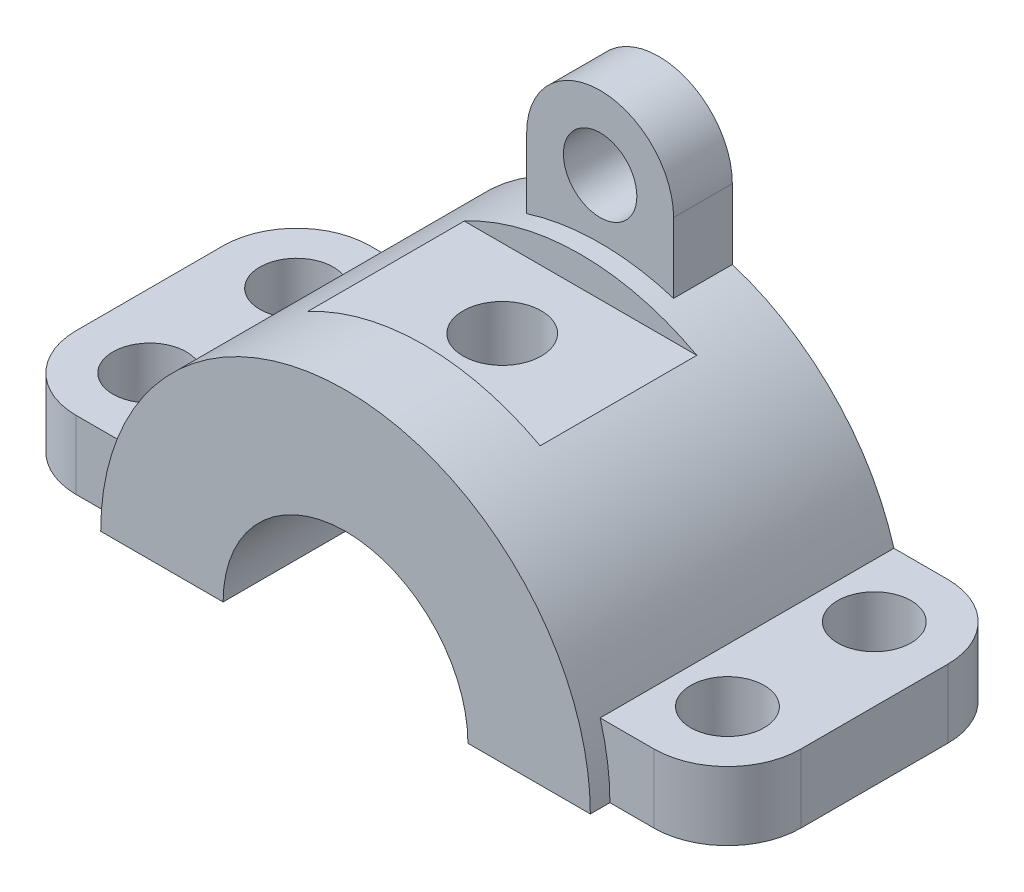
ISO-10303-21;
HEADER;
FILE_DESCRIPTION(('STEP AP214'),'2;1');
FILE_NAME('part.step','',(''),(''),'','','');
FILE_SCHEMA(('AUTOMOTIVE_DESIGN { 1 0 10303 214 1 1 1 1 }'));
ENDSEC;
DATA;
#1=APPLICATION_CONTEXT('core data for automotive mechanical design processes');
#2=APPLICATION_PROTOCOL_DEFINITION('international standard','automotive_design',2000,#1);
#3=PRODUCT_CONTEXT('',#1,'mechanical');
#4=PRODUCT('Part','Part','',(#3));
#5=PRODUCT_RELATED_PRODUCT_CATEGORY('part','',(#4));
#6=PRODUCT_DEFINITION_FORMATION('','',#4);
#7=PRODUCT_DEFINITION_CONTEXT('part definition',#1,'design');
#8=PRODUCT_DEFINITION('design','',#6,#7);
#9=PRODUCT_DEFINITION_SHAPE('','',#8);
#10=(LENGTH_UNIT() NAMED_UNIT(*) SI_UNIT(.MILLI.,.METRE.));
#11=(NAMED_UNIT(*) PLANE_ANGLE_UNIT() SI_UNIT($,.RADIAN.));
#12=(NAMED_UNIT(*) SI_UNIT($,.STERADIAN.) SOLID_ANGLE_UNIT());
#13=UNCERTAINTY_MEASURE_WITH_UNIT(LENGTH_MEASURE(1.E-05),#10,'distance_accuracy_value','');
#14=(GEOMETRIC_REPRESENTATION_CONTEXT(3) GLOBAL_UNCERTAINTY_ASSIGNED_CONTEXT((#13)) GLOBAL_UNIT_ASSIGNED_CONTEXT((#10,
#11,#12)) REPRESENTATION_CONTEXT('',''));
#15=CARTESIAN_POINT('',(0.,0.,0.));
#16=DIRECTION('',(0.,0.,1.));
#17=DIRECTION('',(1.,0.,0.));
#18=AXIS2_PLACEMENT_3D('',#15,#16,#17);
#19=CARTESIAN_POINT('',(0.,0.,64.));
#20=DIRECTION('',(0.,0.,-1.));
#21=DIRECTION('',(-1.,0.,0.));
#22=AXIS2_PLACEMENT_3D('',#19,#20,#21);
#23=CYLINDRICAL_SURFACE('',#22,50.);
#24=CARTESIAN_POINT('',(0.,0.,0.));
#25=DIRECTION('',(0.,0.,1.));
#26=DIRECTION('',(1.,0.,0.));
#27=AXIS2_PLACEMENT_3D('',#24,#25,#26);
#28=CIRCLE('',#27,50.);
#29=CARTESIAN_POINT('',(48.,14.,0.));
#30=VERTEX_POINT('',#29);
#31=CARTESIAN_POINT('',(15.,47.6969600708473,0.));
#32=VERTEX_POINT('',#31);
#33=EDGE_CURVE('E348',#30,#32,#28,.T.);
#34=ORIENTED_EDGE('',*,*,#33,.T.);
#35=DIRECTION('',(0.,0.,-1.));
#36=VECTOR('',#35,1.);
#37=CARTESIAN_POINT('',(15.,47.6969600708473,12.));
#38=LINE('',#37,#36);
#39=CARTESIAN_POINT('',(15.,47.6969600708473,12.));
#40=VERTEX_POINT('',#39);
#41=EDGE_CURVE('E247',#40,#32,#38,.T.);
#42=ORIENTED_EDGE('',*,*,#41,.F.);
#43=CARTESIAN_POINT('',(0.,0.,12.));
#44=DIRECTION('',(0.,0.,1.));
#45=DIRECTION('',(1.,0.,0.));
#46=AXIS2_PLACEMENT_3D('',#43,#44,#45);
#47=CIRCLE('',#46,50.);
#48=CARTESIAN_POINT('',(-15.,47.6969600708473,12.));
#49=VERTEX_POINT('',#48);
#50=EDGE_CURVE('E244',#40,#49,#47,.T.);
#51=ORIENTED_EDGE('',*,*,#50,.T.);
#52=DIRECTION('',(0.,0.,-1.));
#53=VECTOR('',#52,1.);
#54=CARTESIAN_POINT('',(-15.,47.6969600708473,12.));
#55=LINE('',#54,#53);
#56=CARTESIAN_POINT('',(-15.,47.6969600708473,0.));
#57=VERTEX_POINT('',#56);
#58=EDGE_CURVE('E266',#49,#57,#55,.T.);
#59=ORIENTED_EDGE('',*,*,#58,.T.);
#60=CARTESIAN_POINT('',(-48.,14.,0.));
#61=VERTEX_POINT('',#60);
#62=EDGE_CURVE('E347',#57,#61,#28,.T.);
#63=ORIENTED_EDGE('',*,*,#62,.T.);
#64=DIRECTION('',(0.,0.,-1.));
#65=VECTOR('',#64,1.);
#66=CARTESIAN_POINT('',(-48.,14.,60.));
#67=LINE('',#66,#65);
#68=CARTESIAN_POINT('',(-48.,14.,60.));
#69=VERTEX_POINT('',#68);
#70=EDGE_CURVE('E300',#69,#61,#67,.T.);
#71=ORIENTED_EDGE('',*,*,#70,.F.);
#72=CARTESIAN_POINT('',(0.,0.,60.));
#73=DIRECTION('',(0.,0.,1.));
#74=DIRECTION('',(1.,0.,0.));
#75=AXIS2_PLACEMENT_3D('',#72,#73,#74);
#76=CIRCLE('',#75,50.);
#77=CARTESIAN_POINT('',(-50.,0.,60.));
#78=VERTEX_POINT('',#77);
#79=EDGE_CURVE('E278',#69,#78,#76,.T.);
#80=ORIENTED_EDGE('',*,*,#79,.T.);
#81=DIRECTION('',(0.,0.,-1.));
#82=VECTOR('',#81,1.);
#83=CARTESIAN_POINT('',(-50.,0.,64.));
#84=LINE('',#83,#82);
#85=CARTESIAN_POINT('',(-50.,0.,64.));
#86=VERTEX_POINT('',#85);
#87=EDGE_CURVE('E363',#86,#78,#84,.T.);
#88=ORIENTED_EDGE('',*,*,#87,.F.);
#89=CARTESIAN_POINT('',(0.,0.,64.));
#90=DIRECTION('',(0.,0.,1.));
#91=DIRECTION('',(1.,0.,0.));
#92=AXIS2_PLACEMENT_3D('',#89,#90,#91);
#93=CIRCLE('',#92,50.);
#94=CARTESIAN_POINT('',(50.,0.,64.));
#95=VERTEX_POINT('',#94);
#96=EDGE_CURVE('E332',#95,#86,#93,.T.);
#97=ORIENTED_EDGE('',*,*,#96,.F.);
#98=DIRECTION('',(0.,0.,-1.));
#99=VECTOR('',#98,1.);
#100=CARTESIAN_POINT('',(50.,0.,64.));
#101=LINE('',#100,#99);
#102=CARTESIAN_POINT('',(50.,0.,60.));
#103=VERTEX_POINT('',#102);
#104=EDGE_CURVE('E367',#95,#103,#101,.T.);
#105=ORIENTED_EDGE('',*,*,#104,.T.);
#106=CARTESIAN_POINT('',(0.,0.,60.));
#107=DIRECTION('',(0.,0.,1.));
#108=DIRECTION('',(1.,0.,0.));
#109=AXIS2_PLACEMENT_3D('',#106,#107,#108);
#110=CIRCLE('',#109,50.);
#111=CARTESIAN_POINT('',(48.,14.,60.));
#112=VERTEX_POINT('',#111);
#113=EDGE_CURVE('E305',#103,#112,#110,.T.);
#114=ORIENTED_EDGE('',*,*,#113,.T.);
#115=DIRECTION('',(0.,0.,-1.));
#116=VECTOR('',#115,1.);
#117=CARTESIAN_POINT('',(48.,14.,60.));
#118=LINE('',#117,#116);
#119=EDGE_CURVE('E315',#112,#30,#118,.T.);
#120=ORIENTED_EDGE('',*,*,#119,.T.);
#121=EDGE_LOOP('',(#34,#42,#51,#59,#63,#71,#80,#88,#97,#105,#114,#120));
#122=FACE_BOUND('',#121,.T.);
#123=CARTESIAN_POINT('',(0.,0.,16.));
#124=DIRECTION('',(0.,0.,1.));
#125=DIRECTION('',(1.,0.,0.));
#126=AXIS2_PLACEMENT_3D('',#123,#124,#125);
#127=CIRCLE('',#126,50.);
#128=CARTESIAN_POINT('',(23.7486841740758,44.,16.));
#129=VERTEX_POINT('',#128);
#130=CARTESIAN_POINT('',(-23.7486841740758,44.,16.));
#131=VERTEX_POINT('',#130);
#132=EDGE_CURVE('E187',#129,#131,#127,.T.);
#133=ORIENTED_EDGE('',*,*,#132,.F.);
#134=DIRECTION('',(0.,0.,1.));
#135=VECTOR('',#134,1.);
#136=CARTESIAN_POINT('',(23.7486841740758,44.,16.));
#137=LINE('',#136,#135);
#138=CARTESIAN_POINT('',(23.7486841740758,44.,48.));
#139=VERTEX_POINT('',#138);
#140=EDGE_CURVE('E200',#129,#139,#137,.T.);
#141=ORIENTED_EDGE('',*,*,#140,.T.);
#142=CARTESIAN_POINT('',(0.,0.,48.));
#143=DIRECTION('',(0.,0.,1.));
#144=DIRECTION('',(1.,0.,0.));
#145=AXIS2_PLACEMENT_3D('',#142,#143,#144);
#146=CIRCLE('',#145,50.);
#147=CARTESIAN_POINT('',(-23.7486841740758,44.,48.));
#148=VERTEX_POINT('',#147);
#149=EDGE_CURVE('E203',#139,#148,#146,.T.);
#150=ORIENTED_EDGE('',*,*,#149,.T.);
#151=DIRECTION('',(0.,0.,1.));
#152=VECTOR('',#151,1.);
#153=CARTESIAN_POINT('',(-23.7486841740758,44.,16.));
#154=LINE('',#153,#152);
#155=EDGE_CURVE('E198',#131,#148,#154,.T.);
#156=ORIENTED_EDGE('',*,*,#155,.F.);
#157=EDGE_LOOP('',(#133,#141,#150,#156));
#158=FACE_BOUND('',#157,.T.);
#159=ADVANCED_FACE('F47',(#122,#158),#23,.T.);
#160=CARTESIAN_POINT('',(0.,0.,64.));
#161=DIRECTION('',(0.,1.,0.));
#162=DIRECTION('',(0.,0.,1.));
#163=AXIS2_PLACEMENT_3D('',#160,#161,#162);
#164=PLANE('',#163);
#165=CARTESIAN_POINT('',(59.,0.,15.));
#166=DIRECTION('',(0.,1.,0.));
#167=DIRECTION('',(0.,0.,-1.));
#168=AXIS2_PLACEMENT_3D('',#165,#166,#167);
#169=CIRCLE('',#168,7.5);
#170=CARTESIAN_POINT('',(59.,0.,7.5));
#171=VERTEX_POINT('',#170);
#172=EDGE_CURVE('E214',#171,#171,#169,.T.);
#173=ORIENTED_EDGE('',*,*,#172,.T.);
#174=EDGE_LOOP('',(#173));
#175=FACE_BOUND('',#174,.T.);
#176=CARTESIAN_POINT('',(59.,0.,45.));
#177=DIRECTION('',(0.,1.,0.));
#178=DIRECTION('',(0.,0.,1.));
#179=AXIS2_PLACEMENT_3D('',#176,#177,#178);
#180=CIRCLE('',#179,7.5);
#181=CARTESIAN_POINT('',(59.,0.,52.5));
#182=VERTEX_POINT('',#181);
#183=EDGE_CURVE('E207',#182,#182,#180,.T.);
#184=ORIENTED_EDGE('',*,*,#183,.T.);
#185=EDGE_LOOP('',(#184));
#186=FACE_BOUND('',#185,.T.);
#187=DIRECTION('',(1.,0.,0.));
#188=VECTOR('',#187,1.);
#189=CARTESIAN_POINT('',(0.,0.,0.));
#190=LINE('',#189,#188);
#191=CARTESIAN_POINT('',(25.,0.,0.));
#192=VERTEX_POINT('',#191);
#193=CARTESIAN_POINT('',(59.,0.,0.));
#194=VERTEX_POINT('',#193);
#195=EDGE_CURVE('E304',#192,#194,#190,.T.);
#196=ORIENTED_EDGE('',*,*,#195,.T.);
#197=CARTESIAN_POINT('',(59.,0.,15.));
#198=DIRECTION('',(0.,1.,0.));
#199=DIRECTION('',(0.,0.,1.));
#200=AXIS2_PLACEMENT_3D('',#197,#198,#199);
#201=CIRCLE('',#200,15.);
#202=CARTESIAN_POINT('',(74.,0.,15.));
#203=VERTEX_POINT('',#202);
#204=EDGE_CURVE('E394',#194,#203,#201,.F.);
#205=ORIENTED_EDGE('',*,*,#204,.T.);
#206=DIRECTION('',(0.,0.,-1.));
#207=VECTOR('',#206,1.);
#208=CARTESIAN_POINT('',(74.,0.,60.));
#209=LINE('',#208,#207);
#210=CARTESIAN_POINT('',(74.,0.,45.));
#211=VERTEX_POINT('',#210);
#212=EDGE_CURVE('E292',#211,#203,#209,.T.);
#213=ORIENTED_EDGE('',*,*,#212,.F.);
#214=CARTESIAN_POINT('',(59.,0.,45.));
#215=DIRECTION('',(0.,1.,0.));
#216=DIRECTION('',(0.,0.,1.));
#217=AXIS2_PLACEMENT_3D('',#214,#215,#216);
#218=CIRCLE('',#217,15.);
#219=CARTESIAN_POINT('',(59.,0.,60.));
#220=VERTEX_POINT('',#219);
#221=EDGE_CURVE('E391',#211,#220,#218,.F.);
#222=ORIENTED_EDGE('',*,*,#221,.T.);
#223=DIRECTION('',(-1.,0.,0.));
#224=VECTOR('',#223,1.);
#225=CARTESIAN_POINT('',(0.,0.,60.));
#226=LINE('',#225,#224);
#227=EDGE_CURVE('E309',#220,#103,#226,.T.);
#228=ORIENTED_EDGE('',*,*,#227,.T.);
#229=ORIENTED_EDGE('',*,*,#104,.F.);
#230=DIRECTION('',(1.,0.,0.));
#231=VECTOR('',#230,1.);
#232=CARTESIAN_POINT('',(0.,0.,64.));
#233=LINE('',#232,#231);
#234=CARTESIAN_POINT('',(25.,0.,64.));
#235=VERTEX_POINT('',#234);
#236=EDGE_CURVE('E328',#235,#95,#233,.T.);
#237=ORIENTED_EDGE('',*,*,#236,.F.);
#238=DIRECTION('',(0.,0.,-1.));
#239=VECTOR('',#238,1.);
#240=CARTESIAN_POINT('',(25.,0.,64.));
#241=LINE('',#240,#239);
#242=EDGE_CURVE('E343',#235,#192,#241,.T.);
#243=ORIENTED_EDGE('',*,*,#242,.T.);
#244=EDGE_LOOP('',(#196,#205,#213,#222,#228,#229,#237,#243));
#245=FACE_BOUND('',#244,.T.);
#246=ADVANCED_FACE('F453',(#175,#186,#245),#164,.F.);
#247=CARTESIAN_POINT('',(0.,0.,64.));
#248=DIRECTION('',(0.,1.,0.));
#249=DIRECTION('',(0.,0.,1.));
#250=AXIS2_PLACEMENT_3D('',#247,#248,#249);
#251=PLANE('',#250);
#252=CARTESIAN_POINT('',(-59.,0.,45.));
#253=DIRECTION('',(0.,1.,0.));
#254=DIRECTION('',(0.,0.,-1.));
#255=AXIS2_PLACEMENT_3D('',#252,#253,#254);
#256=CIRCLE('',#255,7.5);
#257=CARTESIAN_POINT('',(-59.,0.,37.5));
#258=VERTEX_POINT('',#257);
#259=EDGE_CURVE('E215',#258,#258,#256,.T.);
#260=ORIENTED_EDGE('',*,*,#259,.T.);
#261=EDGE_LOOP('',(#260));
#262=FACE_BOUND('',#261,.T.);
#263=CARTESIAN_POINT('',(-59.,0.,15.));
#264=DIRECTION('',(0.,1.,0.));
#265=DIRECTION('',(0.,0.,1.));
#266=AXIS2_PLACEMENT_3D('',#263,#264,#265);
#267=CIRCLE('',#266,7.5);
#268=CARTESIAN_POINT('',(-59.,0.,22.5));
#269=VERTEX_POINT('',#268);
#270=EDGE_CURVE('E219',#269,#269,#267,.T.);
#271=ORIENTED_EDGE('',*,*,#270,.T.);
#272=EDGE_LOOP('',(#271));
#273=FACE_BOUND('',#272,.T.);
#274=DIRECTION('',(1.,0.,0.));
#275=VECTOR('',#274,1.);
#276=CARTESIAN_POINT('',(0.,0.,60.));
#277=LINE('',#276,#275);
#278=CARTESIAN_POINT('',(-59.,0.,60.));
#279=VERTEX_POINT('',#278);
#280=EDGE_CURVE('E286',#279,#78,#277,.T.);
#281=ORIENTED_EDGE('',*,*,#280,.F.);
#282=CARTESIAN_POINT('',(-59.,0.,45.));
#283=DIRECTION('',(0.,1.,0.));
#284=DIRECTION('',(0.,0.,1.));
#285=AXIS2_PLACEMENT_3D('',#282,#283,#284);
#286=CIRCLE('',#285,15.);
#287=CARTESIAN_POINT('',(-74.,0.,45.));
#288=VERTEX_POINT('',#287);
#289=EDGE_CURVE('E11',#279,#288,#286,.F.);
#290=ORIENTED_EDGE('',*,*,#289,.T.);
#291=DIRECTION('',(0.,0.,-1.));
#292=VECTOR('',#291,1.);
#293=CARTESIAN_POINT('',(-74.,0.,60.));
#294=LINE('',#293,#292);
#295=CARTESIAN_POINT('',(-74.,0.,15.));
#296=VERTEX_POINT('',#295);
#297=EDGE_CURVE('E289',#288,#296,#294,.T.);
#298=ORIENTED_EDGE('',*,*,#297,.T.);
#299=CARTESIAN_POINT('',(-59.,0.,15.));
#300=DIRECTION('',(0.,1.,0.));
#301=DIRECTION('',(0.,0.,1.));
#302=AXIS2_PLACEMENT_3D('',#299,#300,#301);
#303=CIRCLE('',#302,15.);
#304=CARTESIAN_POINT('',(-59.,0.,0.));
#305=VERTEX_POINT('',#304);
#306=EDGE_CURVE('E57',#296,#305,#303,.F.);
#307=ORIENTED_EDGE('',*,*,#306,.T.);
#308=DIRECTION('',(1.,0.,0.));
#309=VECTOR('',#308,1.);
#310=CARTESIAN_POINT('',(0.,0.,0.));
#311=LINE('',#310,#309);
#312=CARTESIAN_POINT('',(-25.,0.,0.));
#313=VERTEX_POINT('',#312);
#314=EDGE_CURVE('E351',#305,#313,#311,.T.);
#315=ORIENTED_EDGE('',*,*,#314,.T.);
#316=DIRECTION('',(0.,0.,-1.));
#317=VECTOR('',#316,1.);
#318=CARTESIAN_POINT('',(-25.,0.,64.));
#319=LINE('',#318,#317);
#320=CARTESIAN_POINT('',(-25.,0.,64.));
#321=VERTEX_POINT('',#320);
#322=EDGE_CURVE('E359',#321,#313,#319,.T.);
#323=ORIENTED_EDGE('',*,*,#322,.F.);
#324=DIRECTION('',(1.,0.,0.));
#325=VECTOR('',#324,1.);
#326=CARTESIAN_POINT('',(0.,0.,64.));
#327=LINE('',#326,#325);
#328=EDGE_CURVE('E336',#86,#321,#327,.T.);
#329=ORIENTED_EDGE('',*,*,#328,.F.);
#330=ORIENTED_EDGE('',*,*,#87,.T.);
#331=EDGE_LOOP('',(#281,#290,#298,#307,#315,#323,#329,#330));
#332=FACE_BOUND('',#331,.T.);
#333=ADVANCED_FACE('F460',(#262,#273,#332),#251,.F.);
#334=CARTESIAN_POINT('',(0.,0.,64.));
#335=DIRECTION('',(0.,0.,-1.));
#336=DIRECTION('',(-1.,0.,0.));
#337=AXIS2_PLACEMENT_3D('',#334,#335,#336);
#338=CYLINDRICAL_SURFACE('',#337,25.);
#339=CARTESIAN_POINT('',(0.,25.,40.));
#340=CARTESIAN_POINT('',(-0.218743265247565,24.9999999061477,39.9999998628105));
#341=CARTESIAN_POINT('',(-0.437488884251339,24.9971224010622,39.9910211081087));
#342=CARTESIAN_POINT('',(-0.87336189831748,24.985691347525,39.9551906748163));
#343=CARTESIAN_POINT('',(-1.09048927039918,24.9771377186217,39.9283387428966));
#344=CARTESIAN_POINT('',(-1.52153070666352,24.9545891858396,39.8570136966574));
#345=CARTESIAN_POINT('',(-1.73544490489068,24.9405945096043,39.8125413195441));
#346=CARTESIAN_POINT('',(-2.15863313908122,24.9075364102002,39.7063554259033));
#347=CARTESIAN_POINT('',(-2.36790535620395,24.888471036932,39.6446352757271));
#348=CARTESIAN_POINT('',(-2.77988031823148,24.8458260104941,39.5046321268035));
#349=CARTESIAN_POINT('',(-2.98259542357034,24.8222555090754,39.4263826724808));
#350=CARTESIAN_POINT('',(-3.3806527559984,24.7711822888404,39.253844594609));
#351=CARTESIAN_POINT('',(-3.5759921749842,24.7436780910757,39.1595499360163));
#352=CARTESIAN_POINT('',(-3.95794908794835,24.6854603705866,38.9556804571037));
#353=CARTESIAN_POINT('',(-4.1445690395948,24.6547477601795,38.8461099775389));
#354=CARTESIAN_POINT('',(-4.50811504509705,24.5908719246595,38.6123839256726));
#355=CARTESIAN_POINT('',(-4.68503659666327,24.5577075778769,38.4882216621168));
#356=CARTESIAN_POINT('',(-5.03301408453022,24.488796033414,38.2223853092816));
#357=CARTESIAN_POINT('',(-5.20375408879707,24.4530019467294,38.0803096991258));
#358=CARTESIAN_POINT('',(-5.53275380725715,24.3806687959203,37.7825482279537));
#359=CARTESIAN_POINT('',(-5.6910132690735,24.3441297167497,37.6268620918447));
#360=CARTESIAN_POINT('',(-5.99413557676902,24.2712721273087,37.302790073572));
#361=CARTESIAN_POINT('',(-6.13899335443544,24.2349537052978,37.1343994302045));
#362=CARTESIAN_POINT('',(-6.4142713584007,24.1635539684896,36.7860614993963));
#363=CARTESIAN_POINT('',(-6.54469691314274,24.1284722003959,36.6061185161674));
#364=CARTESIAN_POINT('',(-6.79356627376886,24.0596046131892,36.2307796888984));
#365=CARTESIAN_POINT('',(-6.91159914571261,24.0258780779972,36.0351001392605));
#366=CARTESIAN_POINT('',(-7.13064926390917,23.9617792893349,35.6340106052583));
#367=CARTESIAN_POINT('',(-7.23167321503685,23.9314057157688,35.4286044961843));
#368=CARTESIAN_POINT('',(-7.4159292843064,23.8749509852088,35.0093875060848));
#369=CARTESIAN_POINT('',(-7.4991615561078,23.8488697911438,34.7955766976662));
#370=CARTESIAN_POINT('',(-7.64708668337306,23.8018507099147,34.3610854270542));
#371=CARTESIAN_POINT('',(-7.71178030064702,23.7809126114101,34.1404052475576));
#372=CARTESIAN_POINT('',(-7.82027654696604,23.7454507385788,33.7008526312977));
#373=CARTESIAN_POINT('',(-7.8646711461595,23.7307462657405,33.4821408546237));
#374=CARTESIAN_POINT('',(-7.93505826774671,23.7073033405608,33.0414578550603));
#375=CARTESIAN_POINT('',(-7.96105114480748,23.6985647732351,32.8194866950752));
#376=CARTESIAN_POINT('',(-7.99437065635129,23.6873457397689,32.374043844835));
#377=CARTESIAN_POINT('',(-8.00170182918087,23.6848637520901,32.1505725326596));
#378=CARTESIAN_POINT('',(-7.99763563591978,23.6862371500807,31.7038229413516));
#379=CARTESIAN_POINT('',(-7.98623874529433,23.690092374862,31.4805446574626));
#380=CARTESIAN_POINT('',(-7.9457042941483,23.703717269299,31.0452511076057));
#381=CARTESIAN_POINT('',(-7.91733072305877,23.7132321396269,30.8331561687252));
#382=CARTESIAN_POINT('',(-7.84374939322094,23.7376725259022,30.4121471921874));
#383=CARTESIAN_POINT('',(-7.79853566669938,23.7525999598911,30.2032343095305));
#384=CARTESIAN_POINT('',(-7.69168696924465,23.7874147928651,29.7901458318722));
#385=CARTESIAN_POINT('',(-7.63005683359996,23.8073007312625,29.5859688611743));
#386=CARTESIAN_POINT('',(-7.49085223656067,23.8514666562278,29.1835331797193));
#387=CARTESIAN_POINT('',(-7.41327173347221,23.8757483073899,28.9852767442324));
#388=CARTESIAN_POINT('',(-7.24151771277467,23.9284057786095,28.5931069361814));
#389=CARTESIAN_POINT('',(-7.14711609407102,23.9568367598391,28.3993009228504));
#390=CARTESIAN_POINT('',(-6.94318205382553,24.016734069374,28.0202308785065));
#391=CARTESIAN_POINT('',(-6.83364445495079,24.0482014351731,27.8349697993733));
#392=CARTESIAN_POINT('',(-6.60020078291722,24.1133164203648,27.4741267881247));
#393=CARTESIAN_POINT('',(-6.47629393858845,24.1469641567308,27.2985453762453));
#394=CARTESIAN_POINT('',(-6.21490027829255,24.2155584134681,26.9580676690233));
#395=CARTESIAN_POINT('',(-6.07741302148028,24.2505049759786,26.7931717208384));
#396=CARTESIAN_POINT('',(-5.7827580642572,24.3224956711356,26.4673474761484));
#397=CARTESIAN_POINT('',(-5.62496187025066,24.3595598527758,26.306991393903));
#398=CARTESIAN_POINT('',(-5.29641148883157,24.433099471755,26.0001217103981));
#399=CARTESIAN_POINT('',(-5.12566144275533,24.4695750927716,25.8536037184607));
#400=CARTESIAN_POINT('',(-4.77213983863553,24.5409699950185,25.5752575183532));
#401=CARTESIAN_POINT('',(-4.58936277455011,24.575888550969,25.4434361138275));
#402=CARTESIAN_POINT('',(-4.21308321485076,24.6431823932812,25.195540549152));
#403=CARTESIAN_POINT('',(-4.01958499097014,24.6755586803299,25.0794601798093));
#404=CARTESIAN_POINT('',(-3.62126665237258,24.7371662926383,24.8628945620304));
#405=CARTESIAN_POINT('',(-3.41636056460433,24.7663668098111,24.7625585073812));
#406=CARTESIAN_POINT('',(-2.99832036669397,24.8204446279348,24.5796153045643));
#407=CARTESIAN_POINT('',(-2.78518945939642,24.8453235913977,24.497001335781));
#408=CARTESIAN_POINT('',(-2.35217103924886,24.8900514164327,24.3501927487604));
#409=CARTESIAN_POINT('',(-2.13228393720666,24.9099005831638,24.2859970130536));
#410=CARTESIAN_POINT('',(-1.68740364417468,24.9439857927418,24.176629116786));
#411=CARTESIAN_POINT('',(-1.46241066837479,24.9582220716843,24.1314561560631));
#412=CARTESIAN_POINT('',(-1.01822864517731,24.9802051338952,24.0620099459849));
#413=CARTESIAN_POINT('',(-0.799171422951574,24.9881904590846,24.0369673630477));
#414=CARTESIAN_POINT('',(-0.359605520473419,24.998380097374,24.0050491805251));
#415=CARTESIAN_POINT('',(-0.139096881477433,25.0005845740889,23.9981730667754));
#416=CARTESIAN_POINT('',(0.30168438861145,24.9991510782414,24.0026530388314));
#417=CARTESIAN_POINT('',(0.521957047982117,24.99551390883,24.0140066182892));
#418=CARTESIAN_POINT('',(0.960643471861157,24.9825002143682,24.0548322282173));
#419=CARTESIAN_POINT('',(1.17905725268573,24.9731237397469,24.0843040994887));
#420=CARTESIAN_POINT('',(1.60666085758014,24.9492140183119,24.1600680666892));
#421=CARTESIAN_POINT('',(1.81594168521825,24.934824131048,24.2058933383947));
#422=CARTESIAN_POINT('',(2.22986305734505,24.9012216991691,24.3140722950302));
#423=CARTESIAN_POINT('',(2.43450202782658,24.8820075445802,24.3764314981203));
#424=CARTESIAN_POINT('',(2.83767351616122,24.8392571724058,24.5171405641666));
#425=CARTESIAN_POINT('',(3.03620765701014,24.8157221153545,24.5954861340355));
#426=CARTESIAN_POINT('',(3.4260590530831,24.7649102825711,24.767604732679));
#427=CARTESIAN_POINT('',(3.61737354934721,24.737632094513,24.861383587283));
#428=CARTESIAN_POINT('',(3.9961937967253,24.6793044180003,25.0661745521299));
#429=CARTESIAN_POINT('',(4.18348835944252,24.6481783487328,25.1775554837826));
#430=CARTESIAN_POINT('',(4.54814586170992,24.5835041721626,25.4150374650529));
#431=CARTESIAN_POINT('',(4.72550534170238,24.5499552303715,25.5411435956528));
#432=CARTESIAN_POINT('',(5.0691961991725,24.4812982895492,25.8072232399596));
#433=CARTESIAN_POINT('',(5.23552671030185,24.446190168402,25.9471978409147));
#434=CARTESIAN_POINT('',(5.55617802638371,24.3753123574237,26.2401348533353));
#435=CARTESIAN_POINT('',(5.71049855184838,24.3395426522205,26.3930975668778));
#436=CARTESIAN_POINT('',(6.01242126512026,24.2667654969751,26.7177686970901));
#437=CARTESIAN_POINT('',(6.15947074535408,24.2297690083856,26.8899941010449));
#438=CARTESIAN_POINT('',(6.43851923775673,24.1571160782401,27.2464036973992));
#439=CARTESIAN_POINT('',(6.57052327012398,24.1214591923783,27.4305838684802));
#440=CARTESIAN_POINT('',(6.818664580721,24.0524927808986,27.8098699845339));
#441=CARTESIAN_POINT('',(6.93479547633881,24.0191842021299,28.0049802803274));
#442=CARTESIAN_POINT('',(7.15020596800437,23.9559420021258,28.4047144344035));
#443=CARTESIAN_POINT('',(7.24949254862722,23.9260069837647,28.609334304437));
#444=CARTESIAN_POINT('',(7.43020088832158,23.870505447889,29.0261860595362));
#445=CARTESIAN_POINT('',(7.51167310646887,23.8449266381716,29.2383944102204));
#446=CARTESIAN_POINT('',(7.65636529827826,23.7988621590757,29.6693947768714));
#447=CARTESIAN_POINT('',(7.71959257425074,23.7783744525038,29.8881841200535));
#448=CARTESIAN_POINT('',(7.82723033979725,23.7431606371553,30.3307714104139));
#449=CARTESIAN_POINT('',(7.87164342134528,23.7284337347517,30.5545686631923));
#450=CARTESIAN_POINT('',(7.94121566442475,23.7052408808499,31.0054543831978));
#451=CARTESIAN_POINT('',(7.96637569553841,23.6967746465831,31.2325427013088));
#452=CARTESIAN_POINT('',(7.99645049180489,23.6866420864421,31.6773669424558));
#453=CARTESIAN_POINT('',(8.00226930238732,23.6846721480483,31.8950353088546));
#454=CARTESIAN_POINT('',(7.99614679514984,23.6867399313,32.3300921443389));
#455=CARTESIAN_POINT('',(7.98420580907816,23.6907775407262,32.5474806185769));
#456=CARTESIAN_POINT('',(7.94268054634167,23.7047316455029,32.9803580579318));
#457=CARTESIAN_POINT('',(7.91309736864517,23.7146477746681,33.1958471405175));
#458=CARTESIAN_POINT('',(7.83656732967567,23.7400470604446,33.6233835862019));
#459=CARTESIAN_POINT('',(7.78962040030635,23.7555302388885,33.8354309357997));
#460=CARTESIAN_POINT('',(7.67969358667199,23.7912922196723,34.2511736699373));
#461=CARTESIAN_POINT('',(7.61698826998021,23.8114885111398,34.4549489142845));
#462=CARTESIAN_POINT('',(7.47567925141456,23.8562299898703,34.8564903534286));
#463=CARTESIAN_POINT('',(7.39707024932657,23.8807766266318,35.0542545195756));
#464=CARTESIAN_POINT('',(7.2245841069833,23.933522740927,35.4424541768721));
#465=CARTESIAN_POINT('',(7.13070967680563,23.961721569905,35.6328909614473));
#466=CARTESIAN_POINT('',(6.92831365997189,24.0210238998718,36.0054244826735));
#467=CARTESIAN_POINT('',(6.81978682069163,24.0521284412685,36.1875181969862));
#468=CARTESIAN_POINT('',(6.5841334208022,24.1177267113063,36.5494718913765));
#469=CARTESIAN_POINT('',(6.45643079187723,24.1523067527788,36.7289413544939));
#470=CARTESIAN_POINT('',(6.18680926743207,24.2227744441253,37.076591818307));
#471=CARTESIAN_POINT('',(6.0448899286005,24.2586621347526,37.2447724667168));
#472=CARTESIAN_POINT('',(5.74766448038853,24.3307982502988,37.5689068571076));
#473=CARTESIAN_POINT('',(5.592352795832,24.3670468198413,37.7248554548458));
#474=CARTESIAN_POINT('',(5.26938993453573,24.4389215125895,38.0234442035621));
#475=CARTESIAN_POINT('',(5.10174285792805,24.4745478377931,38.1660887412173));
#476=CARTESIAN_POINT('',(4.74894112096545,24.5454895286252,38.4420072742542));
#477=CARTESIAN_POINT('',(4.56337747943053,24.5807495900706,38.5747731976782));
#478=CARTESIAN_POINT('',(4.18131157536835,24.6486157658354,38.8241227770652));
#479=CARTESIAN_POINT('',(3.98481320350349,24.6812228140783,38.9407121378448));
#480=CARTESIAN_POINT('',(3.58214010374018,24.7428727035054,39.1568485607601));
#481=CARTESIAN_POINT('',(3.37596625600628,24.7719158680257,39.2563971692549));
#482=CARTESIAN_POINT('',(2.95536223754053,24.8256070490431,39.4376247276937));
#483=CARTESIAN_POINT('',(2.74093265081571,24.8502553757369,39.5193049389182));
#484=CARTESIAN_POINT('',(2.32073755029346,24.8928821566616,39.6589609606134));
#485=CARTESIAN_POINT('',(2.11542697677707,24.9112083268921,39.7182019539219));
#486=CARTESIAN_POINT('',(1.70037248611578,24.942975795015,39.8201272503359));
#487=CARTESIAN_POINT('',(1.49062887681959,24.9564174309383,39.8628126991706));
#488=CARTESIAN_POINT('',(1.06816763558635,24.9780652480482,39.9312545544041));
#489=CARTESIAN_POINT('',(0.855450551847948,24.9862723816063,39.957014040358));
#490=CARTESIAN_POINT('',(0.428489757171346,24.9972398727651,39.9913870482435));
#491=CARTESIAN_POINT('',(0.214246007569127,25.0000000919227,40.0000001343689));
#492=CARTESIAN_POINT('',(0.,25.,40.));
#493=B_SPLINE_CURVE_WITH_KNOTS('',3,(#339,#340,#341,#342,#343,#344,#345,#346,#347,#348,#349,
#350,#351,#352,#353,#354,#355,#356,#357,#358,#359,#360,#361,#362,#363,#364,#365,#366,#367,#368,
#369,#370,#371,#372,#373,#374,#375,#376,#377,#378,#379,#380,#381,#382,#383,#384,#385,#386,#387,
#388,#389,#390,#391,#392,#393,#394,#395,#396,#397,#398,#399,#400,#401,#402,#403,#404,#405,#406,
#407,#408,#409,#410,#411,#412,#413,#414,#415,#416,#417,#418,#419,#420,#421,#422,#423,#424,#425,
#426,#427,#428,#429,#430,#431,#432,#433,#434,#435,#436,#437,#438,#439,#440,#441,#442,#443,#444,
#445,#446,#447,#448,#449,#450,#451,#452,#453,#454,#455,#456,#457,#458,#459,#460,#461,#462,#463,
#464,#465,#466,#467,#468,#469,#470,#471,#472,#473,#474,#475,#476,#477,#478,#479,#480,#481,#482,
#483,#484,#485,#486,#487,#488,#489,#490,#491,#492),.UNSPECIFIED.,.T.,.F.,(4,2,2,2,2,2,2,2,2,2,2,
2,2,2,2,2,2,2,2,2,2,2,2,2,2,2,2,2,2,2,2,2,2,2,2,2,2,2,2,2,2,2,2,2,2,2,2,2,2,2,2,2,2,2,2,2,2,2,2,
2,2,2,2,2,2,2,2,2,2,2,2,2,2,2,2,2,4),(0.,0.656031665610723,1.3120726298196,1.96808614941623,
2.62435232579349,3.27929926101469,3.93449308656879,4.58950111124318,5.24481067914069,
5.91900362945156,6.59321020954772,7.26767072585324,7.94188139147921,8.63402376289965,
9.32589265142228,10.0177555643119,10.7095900423567,11.3797100261309,12.0498170939437,
12.7197611826031,13.3896882630868,14.0315222200871,14.673583845389,15.3154565665988,
15.9575728663221,16.6091708298972,17.2609922298909,17.9128486280966,18.5647261937175,
19.2479546420813,19.9309655759316,20.6142914015881,21.2973468942376,21.9865280662665,
22.6754435186197,23.3643171643094,24.0531618307572,24.7142284876896,25.375276434299,
26.0362335031196,26.6971847644316,27.3406067356917,27.9842437183902,28.6277080813896,
29.2714159018675,29.9310423920676,30.5908971650853,31.2508037098049,31.9107256068116,
32.5983077197442,33.2856597320606,33.9732873216336,34.6606290825568,35.3459979798137,
36.0310921850404,36.7160919762156,37.4010608269017,38.0535257793629,38.7059785441072,
39.3583906704753,40.0108053554695,40.6525575617292,41.2945239978233,41.9363765895294,
42.5784598877874,43.2465993670095,43.9147596869244,44.5831995145325,45.2514181560312,
45.9432092356098,46.6347557250828,47.3262394270222,48.0176743032877,48.660363380784,
49.303007972936,49.9455356082041,50.588079574241),.UNSPECIFIED.);
#494=CARTESIAN_POINT('',(0.,25.,40.));
#495=VERTEX_POINT('',#494);
#496=EDGE_CURVE('E567',#495,#495,#493,.T.);
#497=ORIENTED_EDGE('',*,*,#496,.F.);
#498=EDGE_LOOP('',(#497));
#499=FACE_BOUND('',#498,.T.);
#500=CARTESIAN_POINT('',(0.,0.,0.));
#501=DIRECTION('',(0.,0.,1.));
#502=DIRECTION('',(1.,0.,0.));
#503=AXIS2_PLACEMENT_3D('',#500,#501,#502);
#504=CIRCLE('',#503,25.);
#505=EDGE_CURVE('E333',#192,#313,#504,.T.);
#506=ORIENTED_EDGE('',*,*,#505,.F.);
#507=ORIENTED_EDGE('',*,*,#242,.F.);
#508=CARTESIAN_POINT('',(0.,0.,64.));
#509=DIRECTION('',(0.,0.,1.));
#510=DIRECTION('',(1.,0.,0.));
#511=AXIS2_PLACEMENT_3D('',#508,#509,#510);
#512=CIRCLE('',#511,25.);
#513=EDGE_CURVE('E339',#235,#321,#512,.T.);
#514=ORIENTED_EDGE('',*,*,#513,.T.);
#515=ORIENTED_EDGE('',*,*,#322,.T.);
#516=EDGE_LOOP('',(#506,#507,#514,#515));
#517=FACE_BOUND('',#516,.T.);
#518=ADVANCED_FACE('F502',(#499,#517),#338,.F.);
#519=CARTESIAN_POINT('',(0.,0.,64.));
#520=DIRECTION('',(0.,0.,1.));
#521=DIRECTION('',(1.,0.,0.));
#522=AXIS2_PLACEMENT_3D('',#519,#520,#521);
#523=PLANE('',#522);
#524=ORIENTED_EDGE('',*,*,#236,.T.);
#525=ORIENTED_EDGE('',*,*,#96,.T.);
#526=ORIENTED_EDGE('',*,*,#328,.T.);
#527=ORIENTED_EDGE('',*,*,#513,.F.);
#528=EDGE_LOOP('',(#524,#525,#526,#527));
#529=FACE_BOUND('',#528,.T.);
#530=ADVANCED_FACE('F508',(#529),#523,.T.);
#531=CARTESIAN_POINT('',(0.,0.,0.));
#532=DIRECTION('',(0.,0.,1.));
#533=DIRECTION('',(1.,0.,0.));
#534=AXIS2_PLACEMENT_3D('',#531,#532,#533);
#535=PLANE('',#534);
#536=DIRECTION('',(-1.,0.,0.));
#537=VECTOR('',#536,1.);
#538=CARTESIAN_POINT('',(0.,14.,0.));
#539=LINE('',#538,#537);
#540=CARTESIAN_POINT('',(59.,14.,0.));
#541=VERTEX_POINT('',#540);
#542=EDGE_CURVE('E277',#541,#30,#539,.T.);
#543=ORIENTED_EDGE('',*,*,#542,.F.);
#544=DIRECTION('',(0.,1.,0.));
#545=VECTOR('',#544,1.);
#546=CARTESIAN_POINT('',(59.,0.,0.));
#547=LINE('',#546,#545);
#548=EDGE_CURVE('E388',#541,#194,#547,.F.);
#549=ORIENTED_EDGE('',*,*,#548,.T.);
#550=ORIENTED_EDGE('',*,*,#195,.F.);
#551=ORIENTED_EDGE('',*,*,#505,.T.);
#552=ORIENTED_EDGE('',*,*,#314,.F.);
#553=DIRECTION('',(0.,1.,0.));
#554=VECTOR('',#553,1.);
#555=CARTESIAN_POINT('',(-59.,14.,0.));
#556=LINE('',#555,#554);
#557=CARTESIAN_POINT('',(-59.,14.,0.));
#558=VERTEX_POINT('',#557);
#559=EDGE_CURVE('E384',#305,#558,#556,.T.);
#560=ORIENTED_EDGE('',*,*,#559,.T.);
#561=DIRECTION('',(1.,0.,0.));
#562=VECTOR('',#561,1.);
#563=CARTESIAN_POINT('',(0.,14.,0.));
#564=LINE('',#563,#562);
#565=EDGE_CURVE('E283',#558,#61,#564,.T.);
#566=ORIENTED_EDGE('',*,*,#565,.T.);
#567=ORIENTED_EDGE('',*,*,#62,.F.);
#568=DIRECTION('',(0.,-1.,0.));
#569=VECTOR('',#568,1.);
#570=CARTESIAN_POINT('',(-15.,0.,0.));
#571=LINE('',#570,#569);
#572=CARTESIAN_POINT('',(-15.,62.,0.));
#573=VERTEX_POINT('',#572);
#574=EDGE_CURVE('E232',#573,#57,#571,.T.);
#575=ORIENTED_EDGE('',*,*,#574,.F.);
#576=CARTESIAN_POINT('',(0.,62.,0.));
#577=DIRECTION('',(0.,0.,1.));
#578=DIRECTION('',(1.,0.,0.));
#579=AXIS2_PLACEMENT_3D('',#576,#577,#578);
#580=CIRCLE('',#579,15.);
#581=CARTESIAN_POINT('',(15.,62.,0.));
#582=VERTEX_POINT('',#581);
#583=EDGE_CURVE('E256',#582,#573,#580,.T.);
#584=ORIENTED_EDGE('',*,*,#583,.F.);
#585=DIRECTION('',(0.,-1.,0.));
#586=VECTOR('',#585,1.);
#587=CARTESIAN_POINT('',(15.,0.,0.));
#588=LINE('',#587,#586);
#589=EDGE_CURVE('E252',#582,#32,#588,.T.);
#590=ORIENTED_EDGE('',*,*,#589,.T.);
#591=ORIENTED_EDGE('',*,*,#33,.F.);
#592=EDGE_LOOP('',(#543,#549,#550,#551,#552,#560,#566,#567,#575,#584,#590,#591));
#593=FACE_BOUND('',#592,.T.);
#594=CARTESIAN_POINT('',(0.,62.,0.));
#595=DIRECTION('',(0.,0.,1.));
#596=DIRECTION('',(1.,0.,0.));
#597=AXIS2_PLACEMENT_3D('',#594,#595,#596);
#598=CIRCLE('',#597,7.5);
#599=CARTESIAN_POINT('',(7.5,62.,0.));
#600=VERTEX_POINT('',#599);
#601=EDGE_CURVE('E248',#600,#600,#598,.T.);
#602=ORIENTED_EDGE('',*,*,#601,.T.);
#603=EDGE_LOOP('',(#602));
#604=FACE_BOUND('',#603,.T.);
#605=ADVANCED_FACE('F496',(#593,#604),#535,.F.);
#606=CARTESIAN_POINT('',(74.,0.,60.));
#607=DIRECTION('',(-1.,0.,0.));
#608=DIRECTION('',(0.,0.,1.));
#609=AXIS2_PLACEMENT_3D('',#606,#607,#608);
#610=PLANE('',#609);
#611=ORIENTED_EDGE('',*,*,#212,.T.);
#612=DIRECTION('',(0.,1.,0.));
#613=VECTOR('',#612,1.);
#614=CARTESIAN_POINT('',(74.,0.,15.));
#615=LINE('',#614,#613);
#616=CARTESIAN_POINT('',(74.,14.,15.));
#617=VERTEX_POINT('',#616);
#618=EDGE_CURVE('E374',#203,#617,#615,.T.);
#619=ORIENTED_EDGE('',*,*,#618,.T.);
#620=DIRECTION('',(0.,0.,-1.));
#621=VECTOR('',#620,1.);
#622=CARTESIAN_POINT('',(74.,14.,60.));
#623=LINE('',#622,#621);
#624=CARTESIAN_POINT('',(74.,14.,45.));
#625=VERTEX_POINT('',#624);
#626=EDGE_CURVE('E321',#625,#617,#623,.T.);
#627=ORIENTED_EDGE('',*,*,#626,.F.);
#628=DIRECTION('',(0.,1.,0.));
#629=VECTOR('',#628,1.);
#630=CARTESIAN_POINT('',(74.,0.,45.));
#631=LINE('',#630,#629);
#632=EDGE_CURVE('E371',#625,#211,#631,.F.);
#633=ORIENTED_EDGE('',*,*,#632,.T.);
#634=EDGE_LOOP('',(#611,#619,#627,#633));
#635=FACE_BOUND('',#634,.T.);
#636=ADVANCED_FACE('F539',(#635),#610,.F.);
#637=CARTESIAN_POINT('',(0.,14.,60.));
#638=DIRECTION('',(0.,-1.,0.));
#639=DIRECTION('',(0.,0.,-1.));
#640=AXIS2_PLACEMENT_3D('',#637,#638,#639);
#641=PLANE('',#640);
#642=CARTESIAN_POINT('',(59.,14.,15.));
#643=DIRECTION('',(0.,-1.,0.));
#644=DIRECTION('',(0.,0.,-1.));
#645=AXIS2_PLACEMENT_3D('',#642,#643,#644);
#646=CIRCLE('',#645,7.5);
#647=CARTESIAN_POINT('',(59.,14.,7.5));
#648=VERTEX_POINT('',#647);
#649=EDGE_CURVE('E51',#648,#648,#646,.T.);
#650=ORIENTED_EDGE('',*,*,#649,.T.);
#651=EDGE_LOOP('',(#650));
#652=FACE_BOUND('',#651,.T.);
#653=CARTESIAN_POINT('',(59.,14.,45.));
#654=DIRECTION('',(0.,-1.,0.));
#655=DIRECTION('',(0.,0.,-1.));
#656=AXIS2_PLACEMENT_3D('',#653,#654,#655);
#657=CIRCLE('',#656,7.5);
#658=CARTESIAN_POINT('',(59.,14.,37.5));
#659=VERTEX_POINT('',#658);
#660=EDGE_CURVE('E424',#659,#659,#657,.T.);
#661=ORIENTED_EDGE('',*,*,#660,.T.);
#662=EDGE_LOOP('',(#661));
#663=FACE_BOUND('',#662,.T.);
#664=ORIENTED_EDGE('',*,*,#626,.T.);
#665=CARTESIAN_POINT('',(59.,14.,15.));
#666=DIRECTION('',(0.,-1.,0.));
#667=DIRECTION('',(0.,0.,-1.));
#668=AXIS2_PLACEMENT_3D('',#665,#666,#667);
#669=CIRCLE('',#668,15.);
#670=EDGE_CURVE('E381',#617,#541,#669,.F.);
#671=ORIENTED_EDGE('',*,*,#670,.T.);
#672=ORIENTED_EDGE('',*,*,#542,.T.);
#673=ORIENTED_EDGE('',*,*,#119,.F.);
#674=DIRECTION('',(-1.,0.,0.));
#675=VECTOR('',#674,1.);
#676=CARTESIAN_POINT('',(0.,14.,60.));
#677=LINE('',#676,#675);
#678=CARTESIAN_POINT('',(59.,14.,60.));
#679=VERTEX_POINT('',#678);
#680=EDGE_CURVE('E312',#679,#112,#677,.T.);
#681=ORIENTED_EDGE('',*,*,#680,.F.);
#682=CARTESIAN_POINT('',(59.,14.,45.));
#683=DIRECTION('',(0.,-1.,0.));
#684=DIRECTION('',(0.,0.,-1.));
#685=AXIS2_PLACEMENT_3D('',#682,#683,#684);
#686=CIRCLE('',#685,15.);
#687=EDGE_CURVE('E378',#679,#625,#686,.F.);
#688=ORIENTED_EDGE('',*,*,#687,.T.);
#689=EDGE_LOOP('',(#664,#671,#672,#673,#681,#688));
#690=FACE_BOUND('',#689,.T.);
#691=ADVANCED_FACE('F433',(#652,#663,#690),#641,.F.);
#692=CARTESIAN_POINT('',(0.,0.,60.));
#693=DIRECTION('',(0.,0.,1.));
#694=DIRECTION('',(1.,0.,0.));
#695=AXIS2_PLACEMENT_3D('',#692,#693,#694);
#696=PLANE('',#695);
#697=ORIENTED_EDGE('',*,*,#227,.F.);
#698=DIRECTION('',(0.,1.,0.));
#699=VECTOR('',#698,1.);
#700=CARTESIAN_POINT('',(59.,14.,60.));
#701=LINE('',#700,#699);
#702=EDGE_CURVE('E397',#220,#679,#701,.T.);
#703=ORIENTED_EDGE('',*,*,#702,.T.);
#704=ORIENTED_EDGE('',*,*,#680,.T.);
#705=ORIENTED_EDGE('',*,*,#113,.F.);
#706=EDGE_LOOP('',(#697,#703,#704,#705));
#707=FACE_BOUND('',#706,.T.);
#708=ADVANCED_FACE('F546',(#707),#696,.T.);
#709=CARTESIAN_POINT('',(0.,14.,60.));
#710=DIRECTION('',(0.,1.,0.));
#711=DIRECTION('',(0.,0.,1.));
#712=AXIS2_PLACEMENT_3D('',#709,#710,#711);
#713=PLANE('',#712);
#714=CARTESIAN_POINT('',(-59.,14.,45.));
#715=DIRECTION('',(0.,1.,0.));
#716=DIRECTION('',(0.,0.,1.));
#717=AXIS2_PLACEMENT_3D('',#714,#715,#716);
#718=CIRCLE('',#717,7.5);
#719=CARTESIAN_POINT('',(-59.,14.,52.5));
#720=VERTEX_POINT('',#719);
#721=EDGE_CURVE('E421',#720,#720,#718,.T.);
#722=ORIENTED_EDGE('',*,*,#721,.F.);
#723=EDGE_LOOP('',(#722));
#724=FACE_BOUND('',#723,.T.);
#725=CARTESIAN_POINT('',(-59.,14.,15.));
#726=DIRECTION('',(0.,1.,0.));
#727=DIRECTION('',(0.,0.,1.));
#728=AXIS2_PLACEMENT_3D('',#725,#726,#727);
#729=CIRCLE('',#728,7.5);
#730=CARTESIAN_POINT('',(-59.,14.,22.5));
#731=VERTEX_POINT('',#730);
#732=EDGE_CURVE('E226',#731,#731,#729,.T.);
#733=ORIENTED_EDGE('',*,*,#732,.F.);
#734=EDGE_LOOP('',(#733));
#735=FACE_BOUND('',#734,.T.);
#736=DIRECTION('',(0.,0.,-1.));
#737=VECTOR('',#736,1.);
#738=CARTESIAN_POINT('',(-74.,14.,60.));
#739=LINE('',#738,#737);
#740=CARTESIAN_POINT('',(-74.,14.,45.));
#741=VERTEX_POINT('',#740);
#742=CARTESIAN_POINT('',(-74.,14.,15.));
#743=VERTEX_POINT('',#742);
#744=EDGE_CURVE('E296',#741,#743,#739,.T.);
#745=ORIENTED_EDGE('',*,*,#744,.F.);
#746=CARTESIAN_POINT('',(-59.,14.,45.));
#747=DIRECTION('',(0.,1.,0.));
#748=DIRECTION('',(0.,0.,1.));
#749=AXIS2_PLACEMENT_3D('',#746,#747,#748);
#750=CIRCLE('',#749,15.);
#751=CARTESIAN_POINT('',(-59.,14.,60.));
#752=VERTEX_POINT('',#751);
#753=EDGE_CURVE('E411',#741,#752,#750,.T.);
#754=ORIENTED_EDGE('',*,*,#753,.T.);
#755=DIRECTION('',(1.,0.,0.));
#756=VECTOR('',#755,1.);
#757=CARTESIAN_POINT('',(0.,14.,60.));
#758=LINE('',#757,#756);
#759=EDGE_CURVE('E282',#752,#69,#758,.T.);
#760=ORIENTED_EDGE('',*,*,#759,.T.);
#761=ORIENTED_EDGE('',*,*,#70,.T.);
#762=ORIENTED_EDGE('',*,*,#565,.F.);
#763=CARTESIAN_POINT('',(-59.,14.,15.));
#764=DIRECTION('',(0.,1.,0.));
#765=DIRECTION('',(0.,0.,1.));
#766=AXIS2_PLACEMENT_3D('',#763,#764,#765);
#767=CIRCLE('',#766,15.);
#768=EDGE_CURVE('E408',#558,#743,#767,.T.);
#769=ORIENTED_EDGE('',*,*,#768,.T.);
#770=EDGE_LOOP('',(#745,#754,#760,#761,#762,#769));
#771=FACE_BOUND('',#770,.T.);
#772=ADVANCED_FACE('F515',(#724,#735,#771),#713,.T.);
#773=CARTESIAN_POINT('',(-74.,0.,60.));
#774=DIRECTION('',(-1.,0.,0.));
#775=DIRECTION('',(0.,0.,1.));
#776=AXIS2_PLACEMENT_3D('',#773,#774,#775);
#777=PLANE('',#776);
#778=ORIENTED_EDGE('',*,*,#297,.F.);
#779=DIRECTION('',(0.,1.,0.));
#780=VECTOR('',#779,1.);
#781=CARTESIAN_POINT('',(-74.,0.,45.));
#782=LINE('',#781,#780);
#783=EDGE_CURVE('E404',#288,#741,#782,.T.);
#784=ORIENTED_EDGE('',*,*,#783,.T.);
#785=ORIENTED_EDGE('',*,*,#744,.T.);
#786=DIRECTION('',(0.,1.,0.));
#787=VECTOR('',#786,1.);
#788=CARTESIAN_POINT('',(-74.,0.,15.));
#789=LINE('',#788,#787);
#790=EDGE_CURVE('E401',#743,#296,#789,.F.);
#791=ORIENTED_EDGE('',*,*,#790,.T.);
#792=EDGE_LOOP('',(#778,#784,#785,#791));
#793=FACE_BOUND('',#792,.T.);
#794=ADVANCED_FACE('F488',(#793),#777,.T.);
#795=CARTESIAN_POINT('',(0.,0.,60.));
#796=DIRECTION('',(0.,0.,1.));
#797=DIRECTION('',(1.,0.,0.));
#798=AXIS2_PLACEMENT_3D('',#795,#796,#797);
#799=PLANE('',#798);
#800=ORIENTED_EDGE('',*,*,#759,.F.);
#801=DIRECTION('',(0.,1.,0.));
#802=VECTOR('',#801,1.);
#803=CARTESIAN_POINT('',(-59.,0.,60.));
#804=LINE('',#803,#802);
#805=EDGE_CURVE('E72',#752,#279,#804,.F.);
#806=ORIENTED_EDGE('',*,*,#805,.T.);
#807=ORIENTED_EDGE('',*,*,#280,.T.);
#808=ORIENTED_EDGE('',*,*,#79,.F.);
#809=EDGE_LOOP('',(#800,#806,#807,#808));
#810=FACE_BOUND('',#809,.T.);
#811=ADVANCED_FACE('F513',(#810),#799,.T.);
#812=CARTESIAN_POINT('',(15.,0.,12.));
#813=DIRECTION('',(1.,0.,0.));
#814=DIRECTION('',(0.,1.,0.));
#815=AXIS2_PLACEMENT_3D('',#812,#813,#814);
#816=PLANE('',#815);
#817=ORIENTED_EDGE('',*,*,#589,.F.);
#818=DIRECTION('',(0.,0.,-1.));
#819=VECTOR('',#818,1.);
#820=CARTESIAN_POINT('',(15.,62.,12.));
#821=LINE('',#820,#819);
#822=CARTESIAN_POINT('',(15.,62.,12.));
#823=VERTEX_POINT('',#822);
#824=EDGE_CURVE('E274',#823,#582,#821,.T.);
#825=ORIENTED_EDGE('',*,*,#824,.F.);
#826=DIRECTION('',(0.,-1.,0.));
#827=VECTOR('',#826,1.);
#828=CARTESIAN_POINT('',(15.,0.,12.));
#829=LINE('',#828,#827);
#830=EDGE_CURVE('E231',#823,#40,#829,.T.);
#831=ORIENTED_EDGE('',*,*,#830,.T.);
#832=ORIENTED_EDGE('',*,*,#41,.T.);
#833=EDGE_LOOP('',(#817,#825,#831,#832));
#834=FACE_BOUND('',#833,.T.);
#835=ADVANCED_FACE('F527',(#834),#816,.T.);
#836=CARTESIAN_POINT('',(0.,62.,12.));
#837=DIRECTION('',(0.,0.,-1.));
#838=DIRECTION('',(-1.,0.,0.));
#839=AXIS2_PLACEMENT_3D('',#836,#837,#838);
#840=CYLINDRICAL_SURFACE('',#839,15.);
#841=ORIENTED_EDGE('',*,*,#583,.T.);
#842=DIRECTION('',(0.,0.,-1.));
#843=VECTOR('',#842,1.);
#844=CARTESIAN_POINT('',(-15.,62.,12.));
#845=LINE('',#844,#843);
#846=CARTESIAN_POINT('',(-15.,62.,12.));
#847=VERTEX_POINT('',#846);
#848=EDGE_CURVE('E270',#847,#573,#845,.T.);
#849=ORIENTED_EDGE('',*,*,#848,.F.);
#850=CARTESIAN_POINT('',(0.,62.,12.));
#851=DIRECTION('',(0.,0.,1.));
#852=DIRECTION('',(1.,0.,0.));
#853=AXIS2_PLACEMENT_3D('',#850,#851,#852);
#854=CIRCLE('',#853,15.);
#855=EDGE_CURVE('E236',#823,#847,#854,.T.);
#856=ORIENTED_EDGE('',*,*,#855,.F.);
#857=ORIENTED_EDGE('',*,*,#824,.T.);
#858=EDGE_LOOP('',(#841,#849,#856,#857));
#859=FACE_BOUND('',#858,.T.);
#860=ADVANCED_FACE('F770',(#859),#840,.T.);
#861=CARTESIAN_POINT('',(-15.,0.,12.));
#862=DIRECTION('',(1.,0.,0.));
#863=DIRECTION('',(0.,1.,0.));
#864=AXIS2_PLACEMENT_3D('',#861,#862,#863);
#865=PLANE('',#864);
#866=ORIENTED_EDGE('',*,*,#574,.T.);
#867=ORIENTED_EDGE('',*,*,#58,.F.);
#868=DIRECTION('',(0.,-1.,0.));
#869=VECTOR('',#868,1.);
#870=CARTESIAN_POINT('',(-15.,0.,12.));
#871=LINE('',#870,#869);
#872=EDGE_CURVE('E240',#847,#49,#871,.T.);
#873=ORIENTED_EDGE('',*,*,#872,.F.);
#874=ORIENTED_EDGE('',*,*,#848,.T.);
#875=EDGE_LOOP('',(#866,#867,#873,#874));
#876=FACE_BOUND('',#875,.T.);
#877=ADVANCED_FACE('F520',(#876),#865,.F.);
#878=CARTESIAN_POINT('',(0.,62.,12.));
#879=DIRECTION('',(0.,0.,-1.));
#880=DIRECTION('',(-1.,0.,0.));
#881=AXIS2_PLACEMENT_3D('',#878,#879,#880);
#882=CYLINDRICAL_SURFACE('',#881,7.5);
#883=CARTESIAN_POINT('',(0.,62.,12.));
#884=DIRECTION('',(0.,0.,1.));
#885=DIRECTION('',(1.,0.,0.));
#886=AXIS2_PLACEMENT_3D('',#883,#884,#885);
#887=CIRCLE('',#886,7.5);
#888=CARTESIAN_POINT('',(7.5,62.,12.));
#889=VERTEX_POINT('',#888);
#890=EDGE_CURVE('E227',#889,#889,#887,.T.);
#891=ORIENTED_EDGE('',*,*,#890,.T.);
#892=EDGE_LOOP('',(#891));
#893=FACE_BOUND('',#892,.T.);
#894=ORIENTED_EDGE('',*,*,#601,.F.);
#895=EDGE_LOOP('',(#894));
#896=FACE_BOUND('',#895,.T.);
#897=ADVANCED_FACE('F753',(#893,#896),#882,.F.);
#898=CARTESIAN_POINT('',(0.,0.,12.));
#899=DIRECTION('',(0.,0.,1.));
#900=DIRECTION('',(1.,0.,0.));
#901=AXIS2_PLACEMENT_3D('',#898,#899,#900);
#902=PLANE('',#901);
#903=ORIENTED_EDGE('',*,*,#890,.F.);
#904=EDGE_LOOP('',(#903));
#905=FACE_BOUND('',#904,.T.);
#906=ORIENTED_EDGE('',*,*,#830,.F.);
#907=ORIENTED_EDGE('',*,*,#855,.T.);
#908=ORIENTED_EDGE('',*,*,#872,.T.);
#909=ORIENTED_EDGE('',*,*,#50,.F.);
#910=EDGE_LOOP('',(#906,#907,#908,#909));
#911=FACE_BOUND('',#910,.T.);
#912=ADVANCED_FACE('F470',(#905,#911),#902,.T.);
#913=CARTESIAN_POINT('',(59.,0.,15.));
#914=DIRECTION('',(0.,1.,0.));
#915=DIRECTION('',(0.,0.,1.));
#916=AXIS2_PLACEMENT_3D('',#913,#914,#915);
#917=CYLINDRICAL_SURFACE('',#916,15.);
#918=ORIENTED_EDGE('',*,*,#204,.F.);
#919=ORIENTED_EDGE('',*,*,#548,.F.);
#920=ORIENTED_EDGE('',*,*,#670,.F.);
#921=ORIENTED_EDGE('',*,*,#618,.F.);
#922=EDGE_LOOP('',(#918,#919,#920,#921));
#923=FACE_BOUND('',#922,.T.);
#924=ADVANCED_FACE('F466',(#923),#917,.T.);
#925=CARTESIAN_POINT('',(59.,0.,45.));
#926=DIRECTION('',(0.,-1.,0.));
#927=DIRECTION('',(0.,0.,-1.));
#928=AXIS2_PLACEMENT_3D('',#925,#926,#927);
#929=CYLINDRICAL_SURFACE('',#928,15.);
#930=ORIENTED_EDGE('',*,*,#221,.F.);
#931=ORIENTED_EDGE('',*,*,#632,.F.);
#932=ORIENTED_EDGE('',*,*,#687,.F.);
#933=ORIENTED_EDGE('',*,*,#702,.F.);
#934=EDGE_LOOP('',(#930,#931,#932,#933));
#935=FACE_BOUND('',#934,.T.);
#936=ADVANCED_FACE('F469',(#935),#929,.T.);
#937=CARTESIAN_POINT('',(-59.,0.,45.));
#938=DIRECTION('',(0.,1.,0.));
#939=DIRECTION('',(0.,0.,1.));
#940=AXIS2_PLACEMENT_3D('',#937,#938,#939);
#941=CYLINDRICAL_SURFACE('',#940,15.);
#942=ORIENTED_EDGE('',*,*,#289,.F.);
#943=ORIENTED_EDGE('',*,*,#805,.F.);
#944=ORIENTED_EDGE('',*,*,#753,.F.);
#945=ORIENTED_EDGE('',*,*,#783,.F.);
#946=EDGE_LOOP('',(#942,#943,#944,#945));
#947=FACE_BOUND('',#946,.T.);
#948=ADVANCED_FACE('F473',(#947),#941,.T.);
#949=CARTESIAN_POINT('',(-59.,0.,15.));
#950=DIRECTION('',(0.,-1.,0.));
#951=DIRECTION('',(0.,0.,-1.));
#952=AXIS2_PLACEMENT_3D('',#949,#950,#951);
#953=CYLINDRICAL_SURFACE('',#952,15.);
#954=ORIENTED_EDGE('',*,*,#306,.F.);
#955=ORIENTED_EDGE('',*,*,#790,.F.);
#956=ORIENTED_EDGE('',*,*,#768,.F.);
#957=ORIENTED_EDGE('',*,*,#559,.F.);
#958=EDGE_LOOP('',(#954,#955,#956,#957));
#959=FACE_BOUND('',#958,.T.);
#960=ADVANCED_FACE('F49',(#959),#953,.T.);
#961=CARTESIAN_POINT('',(-59.,0.,15.));
#962=DIRECTION('',(0.,1.,0.));
#963=DIRECTION('',(0.,0.,1.));
#964=AXIS2_PLACEMENT_3D('',#961,#962,#963);
#965=CYLINDRICAL_SURFACE('',#964,7.5);
#966=ORIENTED_EDGE('',*,*,#732,.T.);
#967=EDGE_LOOP('',(#966));
#968=FACE_BOUND('',#967,.T.);
#969=ORIENTED_EDGE('',*,*,#270,.F.);
#970=EDGE_LOOP('',(#969));
#971=FACE_BOUND('',#970,.T.);
#972=ADVANCED_FACE('F480',(#968,#971),#965,.F.);
#973=CARTESIAN_POINT('',(-59.,0.,45.));
#974=DIRECTION('',(0.,1.,0.));
#975=DIRECTION('',(0.,0.,1.));
#976=AXIS2_PLACEMENT_3D('',#973,#974,#975);
#977=CYLINDRICAL_SURFACE('',#976,7.5);
#978=ORIENTED_EDGE('',*,*,#721,.T.);
#979=EDGE_LOOP('',(#978));
#980=FACE_BOUND('',#979,.T.);
#981=ORIENTED_EDGE('',*,*,#259,.F.);
#982=EDGE_LOOP('',(#981));
#983=FACE_BOUND('',#982,.T.);
#984=ADVANCED_FACE('F447',(#980,#983),#977,.F.);
#985=CARTESIAN_POINT('',(59.,0.,45.));
#986=DIRECTION('',(0.,1.,0.));
#987=DIRECTION('',(0.,0.,1.));
#988=AXIS2_PLACEMENT_3D('',#985,#986,#987);
#989=CYLINDRICAL_SURFACE('',#988,7.5);
#990=ORIENTED_EDGE('',*,*,#183,.F.);
#991=EDGE_LOOP('',(#990));
#992=FACE_BOUND('',#991,.T.);
#993=ORIENTED_EDGE('',*,*,#660,.F.);
#994=EDGE_LOOP('',(#993));
#995=FACE_BOUND('',#994,.T.);
#996=ADVANCED_FACE('F437',(#992,#995),#989,.F.);
#997=CARTESIAN_POINT('',(59.,0.,15.));
#998=DIRECTION('',(0.,1.,0.));
#999=DIRECTION('',(0.,0.,1.));
#1000=AXIS2_PLACEMENT_3D('',#997,#998,#999);
#1001=CYLINDRICAL_SURFACE('',#1000,7.5);
#1002=ORIENTED_EDGE('',*,*,#172,.F.);
#1003=EDGE_LOOP('',(#1002));
#1004=FACE_BOUND('',#1003,.T.);
#1005=ORIENTED_EDGE('',*,*,#649,.F.);
#1006=EDGE_LOOP('',(#1005));
#1007=FACE_BOUND('',#1006,.T.);
#1008=ADVANCED_FACE('F435',(#1004,#1007),#1001,.F.);
#1009=CARTESIAN_POINT('',(-23.7486841740758,44.,16.));
#1010=DIRECTION('',(0.,-1.,0.));
#1011=DIRECTION('',(0.,0.,-1.));
#1012=AXIS2_PLACEMENT_3D('',#1009,#1010,#1011);
#1013=PLANE('',#1012);
#1014=CARTESIAN_POINT('',(0.,44.,32.));
#1015=DIRECTION('',(0.,1.,0.));
#1016=DIRECTION('',(0.,0.,1.));
#1017=AXIS2_PLACEMENT_3D('',#1014,#1015,#1016);
#1018=CIRCLE('',#1017,8.);
#1019=CARTESIAN_POINT('',(0.,44.,40.));
#1020=VERTEX_POINT('',#1019);
#1021=EDGE_CURVE('E575',#1020,#1020,#1018,.T.);
#1022=ORIENTED_EDGE('',*,*,#1021,.F.);
#1023=EDGE_LOOP('',(#1022));
#1024=FACE_BOUND('',#1023,.T.);
#1025=DIRECTION('',(1.,0.,0.));
#1026=VECTOR('',#1025,1.);
#1027=CARTESIAN_POINT('',(-23.7486841740758,44.,48.));
#1028=LINE('',#1027,#1026);
#1029=EDGE_CURVE('E64',#148,#139,#1028,.T.);
#1030=ORIENTED_EDGE('',*,*,#1029,.T.);
#1031=ORIENTED_EDGE('',*,*,#140,.F.);
#1032=DIRECTION('',(1.,0.,0.));
#1033=VECTOR('',#1032,1.);
#1034=CARTESIAN_POINT('',(-23.7486841740758,44.,16.));
#1035=LINE('',#1034,#1033);
#1036=EDGE_CURVE('E190',#131,#129,#1035,.T.);
#1037=ORIENTED_EDGE('',*,*,#1036,.F.);
#1038=ORIENTED_EDGE('',*,*,#155,.T.);
#1039=EDGE_LOOP('',(#1030,#1031,#1037,#1038));
#1040=FACE_BOUND('',#1039,.T.);
#1041=ADVANCED_FACE('F197',(#1024,#1040),#1013,.F.);
#1042=CARTESIAN_POINT('',(0.,0.,16.));
#1043=DIRECTION('',(0.,0.,1.));
#1044=DIRECTION('',(1.,0.,0.));
#1045=AXIS2_PLACEMENT_3D('',#1042,#1043,#1044);
#1046=PLANE('',#1045);
#1047=ORIENTED_EDGE('',*,*,#132,.T.);
#1048=ORIENTED_EDGE('',*,*,#1036,.T.);
#1049=EDGE_LOOP('',(#1047,#1048));
#1050=FACE_BOUND('',#1049,.T.);
#1051=ADVANCED_FACE('F189',(#1050),#1046,.T.);
#1052=CARTESIAN_POINT('',(0.,0.,48.));
#1053=DIRECTION('',(0.,0.,1.));
#1054=DIRECTION('',(1.,0.,0.));
#1055=AXIS2_PLACEMENT_3D('',#1052,#1053,#1054);
#1056=PLANE('',#1055);
#1057=ORIENTED_EDGE('',*,*,#149,.F.);
#1058=ORIENTED_EDGE('',*,*,#1029,.F.);
#1059=EDGE_LOOP('',(#1057,#1058));
#1060=FACE_BOUND('',#1059,.T.);
#1061=ADVANCED_FACE('F580',(#1060),#1056,.F.);
#1062=CARTESIAN_POINT('',(0.,0.,32.));
#1063=DIRECTION('',(0.,1.,0.));
#1064=DIRECTION('',(0.,0.,1.));
#1065=AXIS2_PLACEMENT_3D('',#1062,#1063,#1064);
#1066=CYLINDRICAL_SURFACE('',#1065,8.);
#1067=ORIENTED_EDGE('',*,*,#496,.T.);
#1068=EDGE_LOOP('',(#1067));
#1069=FACE_BOUND('',#1068,.T.);
#1070=ORIENTED_EDGE('',*,*,#1021,.T.);
#1071=EDGE_LOOP('',(#1070));
#1072=FACE_BOUND('',#1071,.T.);
#1073=ADVANCED_FACE('F576',(#1069,#1072),#1066,.F.);
#1074=CLOSED_SHELL('',(#159,#246,#333,#518,#530,#605,#636,#691,#708,#772,#794,#811,#835,#860,
#877,#897,#912,#924,#936,#948,#960,#972,#984,#996,#1008,#1041,#1051,#1061,#1073));
#1075=MANIFOLD_SOLID_BREP('B2',#1074);
#1076=ADVANCED_BREP_SHAPE_REPRESENTATION('',(#18,#1075),#14);
#1077=SHAPE_DEFINITION_REPRESENTATION(#9,#1076);
ENDSEC;
END-ISO-10303-21;
